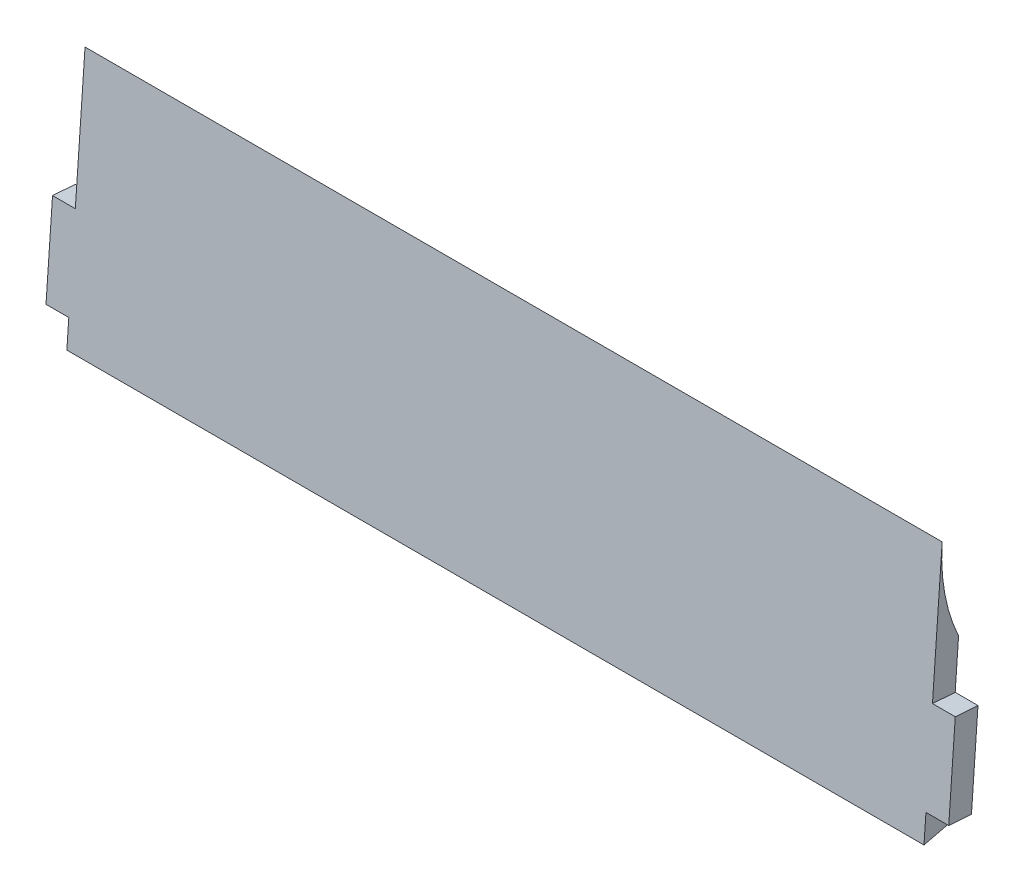
ISO-10303-21;
HEADER;
FILE_DESCRIPTION(('STEP AP214'),'2;1');
FILE_NAME('part.step','',(''),(''),'','','');
FILE_SCHEMA(('AUTOMOTIVE_DESIGN { 1 0 10303 214 1 1 1 1 }'));
ENDSEC;
DATA;
#1=APPLICATION_CONTEXT('core data for automotive mechanical design processes');
#2=APPLICATION_PROTOCOL_DEFINITION('international standard','automotive_design',2000,#1);
#3=PRODUCT_CONTEXT('',#1,'mechanical');
#4=PRODUCT('Part','Part','',(#3));
#5=PRODUCT_RELATED_PRODUCT_CATEGORY('part','',(#4));
#6=PRODUCT_DEFINITION_FORMATION('','',#4);
#7=PRODUCT_DEFINITION_CONTEXT('part definition',#1,'design');
#8=PRODUCT_DEFINITION('design','',#6,#7);
#9=PRODUCT_DEFINITION_SHAPE('','',#8);
#10=(LENGTH_UNIT() NAMED_UNIT(*) SI_UNIT(.MILLI.,.METRE.));
#11=(NAMED_UNIT(*) PLANE_ANGLE_UNIT() SI_UNIT($,.RADIAN.));
#12=(NAMED_UNIT(*) SI_UNIT($,.STERADIAN.) SOLID_ANGLE_UNIT());
#13=UNCERTAINTY_MEASURE_WITH_UNIT(LENGTH_MEASURE(1.E-05),#10,'distance_accuracy_value','');
#14=(GEOMETRIC_REPRESENTATION_CONTEXT(3) GLOBAL_UNCERTAINTY_ASSIGNED_CONTEXT((#13)) GLOBAL_UNIT_ASSIGNED_CONTEXT((#10,
#11,#12)) REPRESENTATION_CONTEXT('',''));
#15=CARTESIAN_POINT('',(0.,0.,0.));
#16=DIRECTION('',(0.,0.,1.));
#17=DIRECTION('',(1.,0.,0.));
#18=AXIS2_PLACEMENT_3D('',#15,#16,#17);
#19=CARTESIAN_POINT('',(59.69,4.04020818557574,-13.9339645320263));
#20=DIRECTION('',(-1.,0.,0.));
#21=DIRECTION('',(0.,0.,1.));
#22=AXIS2_PLACEMENT_3D('',#19,#20,#21);
#23=PLANE('',#22);
#24=DIRECTION('',(0.,0.0715776260552878,0.997435032194222));
#25=VECTOR('',#24,1.);
#26=CARTESIAN_POINT('',(59.69,-5.04830964444227,-8.70294277967424));
#27=LINE('',#26,#25);
#28=CARTESIAN_POINT('',(59.69,-4.57980329059941,-2.17430141669454));
#29=VERTEX_POINT('',#28);
#30=CARTESIAN_POINT('',(59.69,-4.46617380923666,-0.590873303086377));
#31=VERTEX_POINT('',#30);
#32=EDGE_CURVE('E133',#29,#31,#27,.T.);
#33=ORIENTED_EDGE('',*,*,#32,.F.);
#34=DIRECTION('',(0.,0.997435032194223,-0.0715776260552751));
#35=VECTOR('',#34,1.);
#36=CARTESIAN_POINT('',(59.69,-12.305670409903,-1.61988011629));
#37=LINE('',#36,#35);
#38=CARTESIAN_POINT('',(59.69,-1.29697615880648,-2.40988264781174));
#39=VERTEX_POINT('',#38);
#40=EDGE_CURVE('E188',#29,#39,#37,.T.);
#41=ORIENTED_EDGE('',*,*,#40,.T.);
#42=CARTESIAN_POINT('',(59.69,4.04020818557574,-13.9339645320263));
#43=DIRECTION('',(-1.,0.,0.));
#44=DIRECTION('',(0.,0.,1.));
#45=AXIS2_PLACEMENT_3D('',#42,#43,#44);
#46=CIRCLE('',#45,12.7);
#47=CARTESIAN_POINT('',(59.69,4.94924403647798,-1.26653962315965));
#48=VERTEX_POINT('',#47);
#49=EDGE_CURVE('E192',#39,#48,#46,.T.);
#50=ORIENTED_EDGE('',*,*,#49,.T.);
#51=DIRECTION('',(0.,-0.997435032194222,0.0715776260552941));
#52=VECTOR('',#51,1.);
#53=CARTESIAN_POINT('',(59.69,-4.46617380923665,-0.590873303086303));
#54=LINE('',#53,#52);
#55=EDGE_CURVE('E183',#48,#31,#54,.T.);
#56=ORIENTED_EDGE('',*,*,#55,.T.);
#57=EDGE_LOOP('',(#33,#41,#50,#56));
#58=FACE_BOUND('',#57,.T.);
#59=ADVANCED_FACE('F33',(#58),#23,.F.);
#60=CARTESIAN_POINT('',(0.,4.04020818557574,-13.9339645320263));
#61=DIRECTION('',(-1.,0.,0.));
#62=DIRECTION('',(0.,0.,1.));
#63=AXIS2_PLACEMENT_3D('',#60,#61,#62);
#64=PLANE('',#63);
#65=DIRECTION('',(0.,0.997435032194222,-0.0715776260552935));
#66=VECTOR('',#65,1.);
#67=CARTESIAN_POINT('',(0.,-4.5798032905994,-2.17430141669463));
#68=LINE('',#67,#66);
#69=CARTESIAN_POINT('',(0.,-4.57980329059941,-2.17430141669449));
#70=VERTEX_POINT('',#69);
#71=CARTESIAN_POINT('',(0.,-1.29697615880648,-2.40988264781174));
#72=VERTEX_POINT('',#71);
#73=EDGE_CURVE('E200',#70,#72,#68,.T.);
#74=ORIENTED_EDGE('',*,*,#73,.F.);
#75=DIRECTION('',(0.,0.0715776260552878,0.997435032194222));
#76=VECTOR('',#75,1.);
#77=CARTESIAN_POINT('',(0.,-5.04830964444227,-8.70294277967424));
#78=LINE('',#77,#76);
#79=CARTESIAN_POINT('',(0.,-4.46617380923666,-0.590873303086377));
#80=VERTEX_POINT('',#79);
#81=EDGE_CURVE('E177',#70,#80,#78,.T.);
#82=ORIENTED_EDGE('',*,*,#81,.T.);
#83=DIRECTION('',(0.,-0.997435032194222,0.0715776260552878));
#84=VECTOR('',#83,1.);
#85=CARTESIAN_POINT('',(0.,-10.79988626367,-0.1363553776353));
#86=LINE('',#85,#84);
#87=CARTESIAN_POINT('',(0.,4.94924403647798,-1.26653962315965));
#88=VERTEX_POINT('',#87);
#89=EDGE_CURVE('E195',#88,#80,#86,.T.);
#90=ORIENTED_EDGE('',*,*,#89,.F.);
#91=CARTESIAN_POINT('',(0.,4.04020818557574,-13.9339645320263));
#92=DIRECTION('',(-1.,0.,0.));
#93=DIRECTION('',(0.,0.,1.));
#94=AXIS2_PLACEMENT_3D('',#91,#92,#93);
#95=CIRCLE('',#94,12.7);
#96=EDGE_CURVE('E204',#72,#88,#95,.T.);
#97=ORIENTED_EDGE('',*,*,#96,.F.);
#98=EDGE_LOOP('',(#74,#82,#90,#97));
#99=FACE_BOUND('',#98,.T.);
#100=ADVANCED_FACE('F238',(#99),#64,.T.);
#101=CARTESIAN_POINT('',(59.69,-10.79988626367,-0.1363553776353));
#102=DIRECTION('',(0.,-0.0715776260552878,-0.997435032194222));
#103=DIRECTION('',(0.,0.997435032194222,-0.0715776260552878));
#104=AXIS2_PLACEMENT_3D('',#101,#102,#103);
#105=PLANE('',#104);
#106=ORIENTED_EDGE('',*,*,#89,.T.);
#107=DIRECTION('',(-1.,0.,0.));
#108=VECTOR('',#107,1.);
#109=CARTESIAN_POINT('',(-1.5875,-4.46617380923666,-0.590873303086377));
#110=LINE('',#109,#108);
#111=CARTESIAN_POINT('',(-1.5875,-4.46617380923666,-0.590873303086377));
#112=VERTEX_POINT('',#111);
#113=EDGE_CURVE('E56',#80,#112,#110,.T.);
#114=ORIENTED_EDGE('',*,*,#113,.T.);
#115=DIRECTION('',(0.,-0.997435032194222,0.0715776260552878));
#116=VECTOR('',#115,1.);
#117=CARTESIAN_POINT('',(-1.5875,-4.46617380923666,-0.590873303086377));
#118=LINE('',#117,#116);
#119=CARTESIAN_POINT('',(-1.5875,-10.79988626367,-0.1363553776353));
#120=VERTEX_POINT('',#119);
#121=EDGE_CURVE('E159',#112,#120,#118,.T.);
#122=ORIENTED_EDGE('',*,*,#121,.T.);
#123=DIRECTION('',(1.,0.,0.));
#124=VECTOR('',#123,1.);
#125=CARTESIAN_POINT('',(-1.5875,-10.79988626367,-0.1363553776353));
#126=LINE('',#125,#124);
#127=CARTESIAN_POINT('',(0.,-10.79988626367,-0.1363553776353));
#128=VERTEX_POINT('',#127);
#129=EDGE_CURVE('E162',#120,#128,#126,.T.);
#130=ORIENTED_EDGE('',*,*,#129,.T.);
#131=CARTESIAN_POINT('',(0.,-12.7,0.));
#132=VERTEX_POINT('',#131);
#133=EDGE_CURVE('E182',#128,#132,#86,.T.);
#134=ORIENTED_EDGE('',*,*,#133,.T.);
#135=DIRECTION('',(-1.,0.,0.));
#136=VECTOR('',#135,1.);
#137=CARTESIAN_POINT('',(59.69,-12.7,0.));
#138=LINE('',#137,#136);
#139=CARTESIAN_POINT('',(59.69,-12.7,0.));
#140=VERTEX_POINT('',#139);
#141=EDGE_CURVE('E11',#140,#132,#138,.T.);
#142=ORIENTED_EDGE('',*,*,#141,.F.);
#143=CARTESIAN_POINT('',(59.69,-10.79988626367,-0.136355377635185));
#144=VERTEX_POINT('',#143);
#145=EDGE_CURVE('E186',#144,#140,#54,.T.);
#146=ORIENTED_EDGE('',*,*,#145,.F.);
#147=DIRECTION('',(1.,0.,0.));
#148=VECTOR('',#147,1.);
#149=CARTESIAN_POINT('',(61.2775,-10.79988626367,-0.1363553776353));
#150=LINE('',#149,#148);
#151=CARTESIAN_POINT('',(61.2775,-10.79988626367,-0.1363553776353));
#152=VERTEX_POINT('',#151);
#153=EDGE_CURVE('E48',#144,#152,#150,.T.);
#154=ORIENTED_EDGE('',*,*,#153,.T.);
#155=DIRECTION('',(0.,0.997435032194222,-0.0715776260552878));
#156=VECTOR('',#155,1.);
#157=CARTESIAN_POINT('',(61.2775,-4.46617380923666,-0.590873303086377));
#158=LINE('',#157,#156);
#159=CARTESIAN_POINT('',(61.2775,-4.46617380923666,-0.590873303086377));
#160=VERTEX_POINT('',#159);
#161=EDGE_CURVE('E130',#152,#160,#158,.T.);
#162=ORIENTED_EDGE('',*,*,#161,.T.);
#163=DIRECTION('',(-1.,0.,0.));
#164=VECTOR('',#163,1.);
#165=CARTESIAN_POINT('',(61.2775,-4.46617380923666,-0.590873303086377));
#166=LINE('',#165,#164);
#167=EDGE_CURVE('E136',#160,#31,#166,.T.);
#168=ORIENTED_EDGE('',*,*,#167,.T.);
#169=ORIENTED_EDGE('',*,*,#55,.F.);
#170=DIRECTION('',(-1.,0.,0.));
#171=VECTOR('',#170,1.);
#172=CARTESIAN_POINT('',(59.69,4.94924403647798,-1.26653962315965));
#173=LINE('',#172,#171);
#174=EDGE_CURVE('E194',#48,#88,#173,.T.);
#175=ORIENTED_EDGE('',*,*,#174,.T.);
#176=EDGE_LOOP('',(#106,#114,#122,#130,#134,#142,#146,#154,#162,#168,#169,#175));
#177=FACE_BOUND('',#176,.T.);
#178=ADVANCED_FACE('F35',(#177),#105,.F.);
#179=CARTESIAN_POINT('',(59.69,-12.7,0.));
#180=DIRECTION('',(0.,0.971625615768422,0.236524127273802));
#181=DIRECTION('',(0.,-0.236524127273802,0.971625615768423));
#182=AXIS2_PLACEMENT_3D('',#179,#180,#181);
#183=PLANE('',#182);
#184=DIRECTION('',(0.,0.236524127273802,-0.971625615768422));
#185=VECTOR('',#184,1.);
#186=CARTESIAN_POINT('',(0.,-12.7,0.));
#187=LINE('',#186,#185);
#188=CARTESIAN_POINT('',(0.,-12.305670409903,-1.61988011629));
#189=VERTEX_POINT('',#188);
#190=EDGE_CURVE('E197',#132,#189,#187,.T.);
#191=ORIENTED_EDGE('',*,*,#190,.T.);
#192=DIRECTION('',(-1.,0.,0.));
#193=VECTOR('',#192,1.);
#194=CARTESIAN_POINT('',(59.69,-12.305670409903,-1.61988011629));
#195=LINE('',#194,#193);
#196=CARTESIAN_POINT('',(59.69,-12.305670409903,-1.61988011629));
#197=VERTEX_POINT('',#196);
#198=EDGE_CURVE('E41',#197,#189,#195,.T.);
#199=ORIENTED_EDGE('',*,*,#198,.F.);
#200=DIRECTION('',(0.,0.236524127273802,-0.971625615768422));
#201=VECTOR('',#200,1.);
#202=CARTESIAN_POINT('',(59.69,-12.7,0.));
#203=LINE('',#202,#201);
#204=EDGE_CURVE('E185',#140,#197,#203,.T.);
#205=ORIENTED_EDGE('',*,*,#204,.F.);
#206=ORIENTED_EDGE('',*,*,#141,.T.);
#207=EDGE_LOOP('',(#191,#199,#205,#206));
#208=FACE_BOUND('',#207,.T.);
#209=ADVANCED_FACE('F218',(#208),#183,.F.);
#210=CARTESIAN_POINT('',(59.69,-4.5798032905994,-2.17430141669463));
#211=DIRECTION('',(0.,0.0715776260552935,0.997435032194222));
#212=DIRECTION('',(0.,-0.997435032194222,0.0715776260552935));
#213=AXIS2_PLACEMENT_3D('',#210,#211,#212);
#214=PLANE('',#213);
#215=CARTESIAN_POINT('',(0.,-10.9135157450327,-1.71978349124349));
#216=VERTEX_POINT('',#215);
#217=EDGE_CURVE('E201',#189,#216,#68,.T.);
#218=ORIENTED_EDGE('',*,*,#217,.T.);
#219=DIRECTION('',(1.,0.,0.));
#220=VECTOR('',#219,1.);
#221=CARTESIAN_POINT('',(-1.58749999999999,-10.9135157450327,-1.71978349124349));
#222=LINE('',#221,#220);
#223=CARTESIAN_POINT('',(-1.5875,-10.9135157450327,-1.71978349124349));
#224=VERTEX_POINT('',#223);
#225=EDGE_CURVE('E161',#224,#216,#222,.T.);
#226=ORIENTED_EDGE('',*,*,#225,.F.);
#227=DIRECTION('',(0.,-0.997435032194223,0.0715776260552751));
#228=VECTOR('',#227,1.);
#229=CARTESIAN_POINT('',(-1.5875,-4.57980329059949,-2.17430141669448));
#230=LINE('',#229,#228);
#231=CARTESIAN_POINT('',(-1.5875,-4.57980329059941,-2.17430141669449));
#232=VERTEX_POINT('',#231);
#233=EDGE_CURVE('E169',#232,#224,#230,.T.);
#234=ORIENTED_EDGE('',*,*,#233,.F.);
#235=DIRECTION('',(-1.,0.,0.));
#236=VECTOR('',#235,1.);
#237=CARTESIAN_POINT('',(-1.58749999999999,-4.57980329059941,-2.17430141669449));
#238=LINE('',#237,#236);
#239=EDGE_CURVE('E174',#70,#232,#238,.T.);
#240=ORIENTED_EDGE('',*,*,#239,.F.);
#241=ORIENTED_EDGE('',*,*,#73,.T.);
#242=DIRECTION('',(-1.,0.,0.));
#243=VECTOR('',#242,1.);
#244=CARTESIAN_POINT('',(59.69,-1.29697615880648,-2.40988264781174));
#245=LINE('',#244,#243);
#246=EDGE_CURVE('E209',#39,#72,#245,.T.);
#247=ORIENTED_EDGE('',*,*,#246,.F.);
#248=ORIENTED_EDGE('',*,*,#40,.F.);
#249=DIRECTION('',(-1.,0.,0.));
#250=VECTOR('',#249,1.);
#251=CARTESIAN_POINT('',(61.2775,-4.57980329059941,-2.17430141669454));
#252=LINE('',#251,#250);
#253=CARTESIAN_POINT('',(61.2774999999999,-4.57980329059941,-2.17430141669454));
#254=VERTEX_POINT('',#253);
#255=EDGE_CURVE('E150',#254,#29,#252,.T.);
#256=ORIENTED_EDGE('',*,*,#255,.F.);
#257=DIRECTION('',(0.,0.997435032194223,-0.0715776260552751));
#258=VECTOR('',#257,1.);
#259=CARTESIAN_POINT('',(61.2775,-4.5798032905995,-2.17430141669453));
#260=LINE('',#259,#258);
#261=CARTESIAN_POINT('',(61.2774999999999,-10.9135157450327,-1.71978349124354));
#262=VERTEX_POINT('',#261);
#263=EDGE_CURVE('E131',#262,#254,#260,.T.);
#264=ORIENTED_EDGE('',*,*,#263,.F.);
#265=DIRECTION('',(1.,0.,0.));
#266=VECTOR('',#265,1.);
#267=CARTESIAN_POINT('',(61.2775,-10.9135157450327,-1.71978349124354));
#268=LINE('',#267,#266);
#269=CARTESIAN_POINT('',(59.6899999999999,-10.9135157450327,-1.71978349124354));
#270=VERTEX_POINT('',#269);
#271=EDGE_CURVE('E155',#270,#262,#268,.T.);
#272=ORIENTED_EDGE('',*,*,#271,.F.);
#273=EDGE_CURVE('E189',#197,#270,#37,.T.);
#274=ORIENTED_EDGE('',*,*,#273,.F.);
#275=ORIENTED_EDGE('',*,*,#198,.T.);
#276=EDGE_LOOP('',(#218,#226,#234,#240,#241,#247,#248,#256,#264,#272,#274,#275));
#277=FACE_BOUND('',#276,.T.);
#278=ADVANCED_FACE('F215',(#277),#214,.F.);
#279=CARTESIAN_POINT('',(59.69,4.04020818557574,-13.9339645320263));
#280=DIRECTION('',(-1.,0.,0.));
#281=DIRECTION('',(0.,0.,1.));
#282=AXIS2_PLACEMENT_3D('',#279,#280,#281);
#283=CYLINDRICAL_SURFACE('',#282,12.7);
#284=ORIENTED_EDGE('',*,*,#96,.T.);
#285=ORIENTED_EDGE('',*,*,#174,.F.);
#286=ORIENTED_EDGE('',*,*,#49,.F.);
#287=ORIENTED_EDGE('',*,*,#246,.T.);
#288=EDGE_LOOP('',(#284,#285,#286,#287));
#289=FACE_BOUND('',#288,.T.);
#290=ADVANCED_FACE('F241',(#289),#283,.F.);
#291=ORIENTED_EDGE('',*,*,#273,.T.);
#292=DIRECTION('',(0.,0.0715776260552878,0.997435032194222));
#293=VECTOR('',#292,1.);
#294=CARTESIAN_POINT('',(59.69,-11.3820220988756,-8.24842485422316));
#295=LINE('',#294,#293);
#296=EDGE_CURVE('E151',#270,#144,#295,.T.);
#297=ORIENTED_EDGE('',*,*,#296,.T.);
#298=ORIENTED_EDGE('',*,*,#145,.T.);
#299=ORIENTED_EDGE('',*,*,#204,.T.);
#300=EDGE_LOOP('',(#291,#297,#298,#299));
#301=FACE_BOUND('',#300,.T.);
#302=ADVANCED_FACE('F247',(#301),#23,.F.);
#303=DIRECTION('',(0.,0.0715776260552878,0.997435032194222));
#304=VECTOR('',#303,1.);
#305=CARTESIAN_POINT('',(0.,-11.3820220988756,-8.24842485422316));
#306=LINE('',#305,#304);
#307=EDGE_CURVE('E168',#216,#128,#306,.T.);
#308=ORIENTED_EDGE('',*,*,#307,.F.);
#309=ORIENTED_EDGE('',*,*,#217,.F.);
#310=ORIENTED_EDGE('',*,*,#190,.F.);
#311=ORIENTED_EDGE('',*,*,#133,.F.);
#312=EDGE_LOOP('',(#308,#309,#310,#311));
#313=FACE_BOUND('',#312,.T.);
#314=ADVANCED_FACE('F224',(#313),#64,.T.);
#315=CARTESIAN_POINT('',(-1.5875,-11.3820220988756,-8.24842485422316));
#316=DIRECTION('',(0.,-0.997435032194222,0.0715776260552878));
#317=DIRECTION('',(0.,-0.0715776260552878,-0.997435032194222));
#318=AXIS2_PLACEMENT_3D('',#315,#316,#317);
#319=PLANE('',#318);
#320=DIRECTION('',(0.,0.0715776260552878,0.997435032194222));
#321=VECTOR('',#320,1.);
#322=CARTESIAN_POINT('',(-1.5875,-11.3820220988756,-8.24842485422316));
#323=LINE('',#322,#321);
#324=EDGE_CURVE('E172',#224,#120,#323,.T.);
#325=ORIENTED_EDGE('',*,*,#324,.F.);
#326=ORIENTED_EDGE('',*,*,#225,.T.);
#327=ORIENTED_EDGE('',*,*,#307,.T.);
#328=ORIENTED_EDGE('',*,*,#129,.F.);
#329=EDGE_LOOP('',(#325,#326,#327,#328));
#330=FACE_BOUND('',#329,.T.);
#331=ADVANCED_FACE('F228',(#330),#319,.T.);
#332=CARTESIAN_POINT('',(-1.5875,-5.04830964444227,-8.70294277967424));
#333=DIRECTION('',(0.,0.997435032194222,-0.0715776260552878));
#334=DIRECTION('',(0.,0.0715776260552878,0.997435032194222));
#335=AXIS2_PLACEMENT_3D('',#332,#333,#334);
#336=PLANE('',#335);
#337=ORIENTED_EDGE('',*,*,#81,.F.);
#338=ORIENTED_EDGE('',*,*,#239,.T.);
#339=DIRECTION('',(0.,0.0715776260552878,0.997435032194222));
#340=VECTOR('',#339,1.);
#341=CARTESIAN_POINT('',(-1.5875,-5.04830964444227,-8.70294277967424));
#342=LINE('',#341,#340);
#343=EDGE_CURVE('E173',#232,#112,#342,.T.);
#344=ORIENTED_EDGE('',*,*,#343,.T.);
#345=ORIENTED_EDGE('',*,*,#113,.F.);
#346=EDGE_LOOP('',(#337,#338,#344,#345));
#347=FACE_BOUND('',#346,.T.);
#348=ADVANCED_FACE('F235',(#347),#336,.T.);
#349=CARTESIAN_POINT('',(-1.5875,-5.04830964444227,-8.70294277967424));
#350=DIRECTION('',(-1.,0.,0.));
#351=DIRECTION('',(0.,-1.,0.));
#352=AXIS2_PLACEMENT_3D('',#349,#350,#351);
#353=PLANE('',#352);
#354=ORIENTED_EDGE('',*,*,#343,.F.);
#355=ORIENTED_EDGE('',*,*,#233,.T.);
#356=ORIENTED_EDGE('',*,*,#324,.T.);
#357=ORIENTED_EDGE('',*,*,#121,.F.);
#358=EDGE_LOOP('',(#354,#355,#356,#357));
#359=FACE_BOUND('',#358,.T.);
#360=ADVANCED_FACE('F232',(#359),#353,.T.);
#361=CARTESIAN_POINT('',(61.2775,-5.04830964444227,-8.70294277967424));
#362=DIRECTION('',(0.,0.997435032194222,-0.0715776260552878));
#363=DIRECTION('',(0.,0.0715776260552878,0.997435032194222));
#364=AXIS2_PLACEMENT_3D('',#361,#362,#363);
#365=PLANE('',#364);
#366=DIRECTION('',(0.,0.0715776260552878,0.997435032194222));
#367=VECTOR('',#366,1.);
#368=CARTESIAN_POINT('',(61.2775,-5.04830964444227,-8.70294277967424));
#369=LINE('',#368,#367);
#370=EDGE_CURVE('E125',#254,#160,#369,.T.);
#371=ORIENTED_EDGE('',*,*,#370,.F.);
#372=ORIENTED_EDGE('',*,*,#255,.T.);
#373=ORIENTED_EDGE('',*,*,#32,.T.);
#374=ORIENTED_EDGE('',*,*,#167,.F.);
#375=EDGE_LOOP('',(#371,#372,#373,#374));
#376=FACE_BOUND('',#375,.T.);
#377=ADVANCED_FACE('F137',(#376),#365,.T.);
#378=CARTESIAN_POINT('',(61.2775,-11.3820220988756,-8.24842485422316));
#379=DIRECTION('',(0.,-0.997435032194222,0.0715776260552878));
#380=DIRECTION('',(0.,-0.0715776260552878,-0.997435032194222));
#381=AXIS2_PLACEMENT_3D('',#378,#379,#380);
#382=PLANE('',#381);
#383=ORIENTED_EDGE('',*,*,#296,.F.);
#384=ORIENTED_EDGE('',*,*,#271,.T.);
#385=DIRECTION('',(0.,0.0715776260552878,0.997435032194222));
#386=VECTOR('',#385,1.);
#387=CARTESIAN_POINT('',(61.2775,-11.3820220988756,-8.24842485422316));
#388=LINE('',#387,#386);
#389=EDGE_CURVE('E148',#262,#152,#388,.T.);
#390=ORIENTED_EDGE('',*,*,#389,.T.);
#391=ORIENTED_EDGE('',*,*,#153,.F.);
#392=EDGE_LOOP('',(#383,#384,#390,#391));
#393=FACE_BOUND('',#392,.T.);
#394=ADVANCED_FACE('F245',(#393),#382,.T.);
#395=CARTESIAN_POINT('',(61.2775,-5.04830964444227,-8.70294277967424));
#396=DIRECTION('',(1.,0.,0.));
#397=DIRECTION('',(0.,0.,-1.));
#398=AXIS2_PLACEMENT_3D('',#395,#396,#397);
#399=PLANE('',#398);
#400=ORIENTED_EDGE('',*,*,#389,.F.);
#401=ORIENTED_EDGE('',*,*,#263,.T.);
#402=ORIENTED_EDGE('',*,*,#370,.T.);
#403=ORIENTED_EDGE('',*,*,#161,.F.);
#404=EDGE_LOOP('',(#400,#401,#402,#403));
#405=FACE_BOUND('',#404,.T.);
#406=ADVANCED_FACE('F128',(#405),#399,.T.);
#407=CLOSED_SHELL('',(#59,#100,#178,#209,#278,#290,#302,#314,#331,#348,#360,#377,#394,#406));
#408=MANIFOLD_SOLID_BREP('B2',#407);
#409=ADVANCED_BREP_SHAPE_REPRESENTATION('',(#18,#408),#14);
#410=SHAPE_DEFINITION_REPRESENTATION(#9,#409);
ENDSEC;
END-ISO-10303-21;
